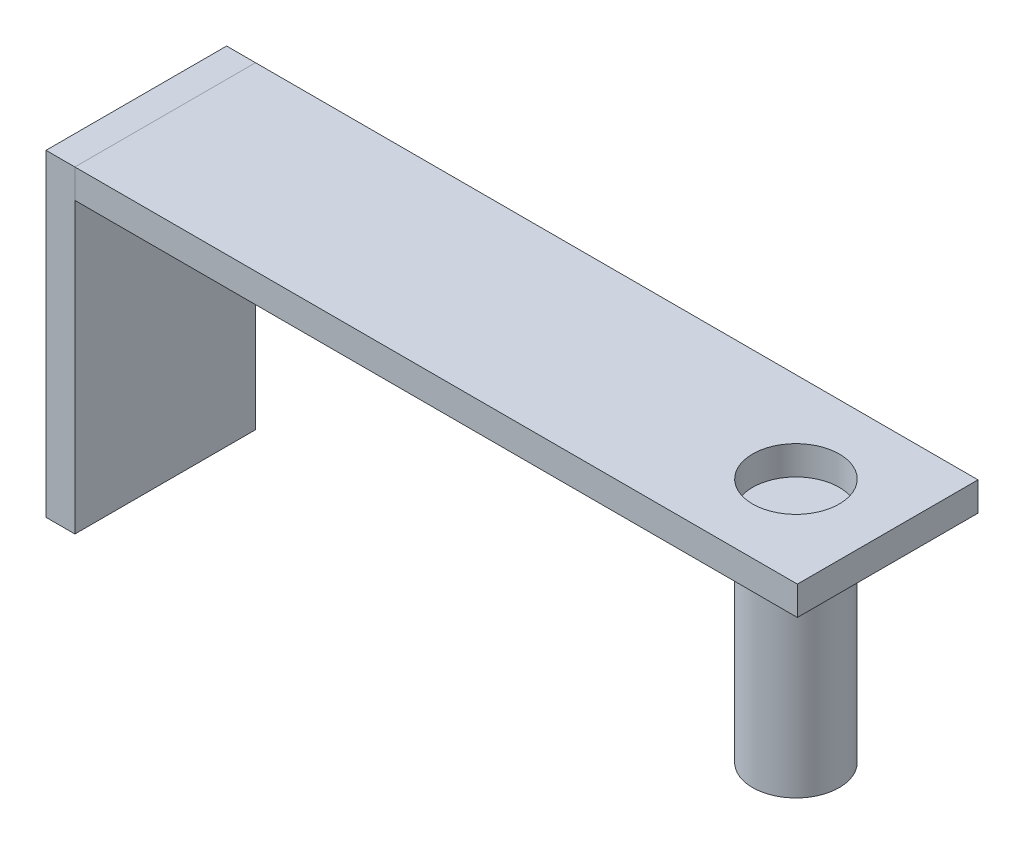
ISO-10303-21;
HEADER;
FILE_DESCRIPTION(('STEP AP214'),'2;1');
FILE_NAME('part.step','',(''),(''),'','','');
FILE_SCHEMA(('AUTOMOTIVE_DESIGN { 1 0 10303 214 1 1 1 1 }'));
ENDSEC;
DATA;
#1=APPLICATION_CONTEXT('core data for automotive mechanical design processes');
#2=APPLICATION_PROTOCOL_DEFINITION('international standard','automotive_design',2000,#1);
#3=PRODUCT_CONTEXT('',#1,'mechanical');
#4=PRODUCT('Part','Part','',(#3));
#5=PRODUCT_RELATED_PRODUCT_CATEGORY('part','',(#4));
#6=PRODUCT_DEFINITION_FORMATION('','',#4);
#7=PRODUCT_DEFINITION_CONTEXT('part definition',#1,'design');
#8=PRODUCT_DEFINITION('design','',#6,#7);
#9=PRODUCT_DEFINITION_SHAPE('','',#8);
#10=(LENGTH_UNIT() NAMED_UNIT(*) SI_UNIT(.MILLI.,.METRE.));
#11=(NAMED_UNIT(*) PLANE_ANGLE_UNIT() SI_UNIT($,.RADIAN.));
#12=(NAMED_UNIT(*) SI_UNIT($,.STERADIAN.) SOLID_ANGLE_UNIT());
#13=UNCERTAINTY_MEASURE_WITH_UNIT(LENGTH_MEASURE(1.E-05),#10,'distance_accuracy_value','');
#14=(GEOMETRIC_REPRESENTATION_CONTEXT(3) GLOBAL_UNCERTAINTY_ASSIGNED_CONTEXT((#13)) GLOBAL_UNIT_ASSIGNED_CONTEXT((#10,
#11,#12)) REPRESENTATION_CONTEXT('',''));
#15=CARTESIAN_POINT('',(0.,0.,0.));
#16=DIRECTION('',(0.,0.,1.));
#17=DIRECTION('',(1.,0.,0.));
#18=AXIS2_PLACEMENT_3D('',#15,#16,#17);
#19=CARTESIAN_POINT('',(18.65,-15.,0.));
#20=DIRECTION('',(0.,1.,0.));
#21=DIRECTION('',(0.,0.,1.));
#22=AXIS2_PLACEMENT_3D('',#19,#20,#21);
#23=CYLINDRICAL_SURFACE('',#22,2.99999999999999);
#24=CARTESIAN_POINT('',(18.65,-15.,0.));
#25=DIRECTION('',(0.,1.,0.));
#26=DIRECTION('',(0.,0.,1.));
#27=AXIS2_PLACEMENT_3D('',#24,#25,#26);
#28=CIRCLE('',#27,2.99999999999999);
#29=CARTESIAN_POINT('',(18.65,-15.,2.99999999999999));
#30=VERTEX_POINT('',#29);
#31=EDGE_CURVE('E11',#30,#30,#28,.T.);
#32=ORIENTED_EDGE('',*,*,#31,.T.);
#33=EDGE_LOOP('',(#32));
#34=FACE_BOUND('',#33,.T.);
#35=CARTESIAN_POINT('',(18.65,0.,0.));
#36=DIRECTION('',(0.,1.,0.));
#37=DIRECTION('',(0.,0.,1.));
#38=AXIS2_PLACEMENT_3D('',#35,#36,#37);
#39=CIRCLE('',#38,2.99999999999999);
#40=CARTESIAN_POINT('',(18.65,0.,2.99999999999999));
#41=VERTEX_POINT('',#40);
#42=EDGE_CURVE('E59',#41,#41,#39,.T.);
#43=ORIENTED_EDGE('',*,*,#42,.F.);
#44=EDGE_LOOP('',(#43));
#45=FACE_BOUND('',#44,.T.);
#46=ADVANCED_FACE('F56',(#34,#45),#23,.T.);
#47=CARTESIAN_POINT('',(0.,-15.,0.));
#48=DIRECTION('',(0.,1.,0.));
#49=DIRECTION('',(0.,0.,1.));
#50=AXIS2_PLACEMENT_3D('',#47,#48,#49);
#51=PLANE('',#50);
#52=ORIENTED_EDGE('',*,*,#31,.F.);
#53=EDGE_LOOP('',(#52));
#54=FACE_BOUND('',#53,.T.);
#55=ADVANCED_FACE('F71',(#54),#51,.F.);
#56=CARTESIAN_POINT('',(0.,0.,0.));
#57=DIRECTION('',(0.,1.,0.));
#58=DIRECTION('',(0.,0.,1.));
#59=AXIS2_PLACEMENT_3D('',#56,#57,#58);
#60=PLANE('',#59);
#61=ORIENTED_EDGE('',*,*,#42,.T.);
#62=EDGE_LOOP('',(#61));
#63=FACE_BOUND('',#62,.T.);
#64=ADVANCED_FACE('F68',(#63),#60,.T.);
#65=CLOSED_SHELL('',(#46,#55,#64));
#66=MANIFOLD_SOLID_BREP('B2',#65);
#67=CARTESIAN_POINT('',(25.,1.99999999999999,0.));
#68=DIRECTION('',(1.,0.,0.));
#69=DIRECTION('',(0.,0.,-1.));
#70=AXIS2_PLACEMENT_3D('',#67,#68,#69);
#71=PLANE('',#70);
#72=DIRECTION('',(0.,0.,1.));
#73=VECTOR('',#72,1.);
#74=CARTESIAN_POINT('',(25.,0.,0.));
#75=LINE('',#74,#73);
#76=CARTESIAN_POINT('',(25.,0.,-6.25));
#77=VERTEX_POINT('',#76);
#78=CARTESIAN_POINT('',(25.,0.,6.25));
#79=VERTEX_POINT('',#78);
#80=EDGE_CURVE('E184',#77,#79,#75,.T.);
#81=ORIENTED_EDGE('',*,*,#80,.F.);
#82=DIRECTION('',(0.,-1.,0.));
#83=VECTOR('',#82,1.);
#84=CARTESIAN_POINT('',(25.,1.99999999999999,-6.25));
#85=LINE('',#84,#83);
#86=CARTESIAN_POINT('',(25.,1.99999999999999,-6.25));
#87=VERTEX_POINT('',#86);
#88=EDGE_CURVE('E54',#87,#77,#85,.T.);
#89=ORIENTED_EDGE('',*,*,#88,.F.);
#90=DIRECTION('',(0.,0.,1.));
#91=VECTOR('',#90,1.);
#92=CARTESIAN_POINT('',(25.,1.99999999999999,0.));
#93=LINE('',#92,#91);
#94=CARTESIAN_POINT('',(25.,1.99999999999999,6.25));
#95=VERTEX_POINT('',#94);
#96=EDGE_CURVE('E170',#87,#95,#93,.T.);
#97=ORIENTED_EDGE('',*,*,#96,.T.);
#98=DIRECTION('',(0.,-1.,0.));
#99=VECTOR('',#98,1.);
#100=CARTESIAN_POINT('',(25.,1.99999999999999,6.25));
#101=LINE('',#100,#99);
#102=EDGE_CURVE('E147',#95,#79,#101,.T.);
#103=ORIENTED_EDGE('',*,*,#102,.T.);
#104=EDGE_LOOP('',(#81,#89,#97,#103));
#105=FACE_BOUND('',#104,.T.);
#106=ADVANCED_FACE('F106',(#105),#71,.T.);
#107=CARTESIAN_POINT('',(0.,1.99999999999999,-6.25));
#108=DIRECTION('',(0.,0.,-1.));
#109=DIRECTION('',(-1.,0.,0.));
#110=AXIS2_PLACEMENT_3D('',#107,#108,#109);
#111=PLANE('',#110);
#112=DIRECTION('',(1.,0.,0.));
#113=VECTOR('',#112,1.);
#114=CARTESIAN_POINT('',(0.,0.,-6.25));
#115=LINE('',#114,#113);
#116=CARTESIAN_POINT('',(-25.,0.,-6.25));
#117=VERTEX_POINT('',#116);
#118=EDGE_CURVE('E159',#117,#77,#115,.T.);
#119=ORIENTED_EDGE('',*,*,#118,.F.);
#120=DIRECTION('',(0.,-1.,0.));
#121=VECTOR('',#120,1.);
#122=CARTESIAN_POINT('',(-25.,1.99999999999999,-6.25));
#123=LINE('',#122,#121);
#124=CARTESIAN_POINT('',(-25.,1.99999999999999,-6.25));
#125=VERTEX_POINT('',#124);
#126=EDGE_CURVE('E116',#125,#117,#123,.T.);
#127=ORIENTED_EDGE('',*,*,#126,.F.);
#128=DIRECTION('',(1.,0.,0.));
#129=VECTOR('',#128,1.);
#130=CARTESIAN_POINT('',(0.,1.99999999999999,-6.25));
#131=LINE('',#130,#129);
#132=EDGE_CURVE('E157',#125,#87,#131,.T.);
#133=ORIENTED_EDGE('',*,*,#132,.T.);
#134=ORIENTED_EDGE('',*,*,#88,.T.);
#135=EDGE_LOOP('',(#119,#127,#133,#134));
#136=FACE_BOUND('',#135,.T.);
#137=ADVANCED_FACE('F155',(#136),#111,.T.);
#138=CARTESIAN_POINT('',(-25.,1.99999999999999,0.));
#139=DIRECTION('',(1.,0.,0.));
#140=DIRECTION('',(0.,0.,-1.));
#141=AXIS2_PLACEMENT_3D('',#138,#139,#140);
#142=PLANE('',#141);
#143=DIRECTION('',(0.,0.,1.));
#144=VECTOR('',#143,1.);
#145=CARTESIAN_POINT('',(-25.,0.,0.));
#146=LINE('',#145,#144);
#147=CARTESIAN_POINT('',(-25.,0.,6.25));
#148=VERTEX_POINT('',#147);
#149=EDGE_CURVE('E189',#117,#148,#146,.T.);
#150=ORIENTED_EDGE('',*,*,#149,.T.);
#151=DIRECTION('',(0.,-1.,0.));
#152=VECTOR('',#151,1.);
#153=CARTESIAN_POINT('',(-25.,1.99999999999999,6.25));
#154=LINE('',#153,#152);
#155=CARTESIAN_POINT('',(-25.,1.99999999999999,6.25));
#156=VERTEX_POINT('',#155);
#157=EDGE_CURVE('E163',#156,#148,#154,.T.);
#158=ORIENTED_EDGE('',*,*,#157,.F.);
#159=DIRECTION('',(0.,0.,1.));
#160=VECTOR('',#159,1.);
#161=CARTESIAN_POINT('',(-25.,1.99999999999999,0.));
#162=LINE('',#161,#160);
#163=EDGE_CURVE('E165',#125,#156,#162,.T.);
#164=ORIENTED_EDGE('',*,*,#163,.F.);
#165=ORIENTED_EDGE('',*,*,#126,.T.);
#166=EDGE_LOOP('',(#150,#158,#164,#165));
#167=FACE_BOUND('',#166,.T.);
#168=ADVANCED_FACE('F166',(#167),#142,.F.);
#169=CARTESIAN_POINT('',(18.65,1.99999999999999,0.));
#170=DIRECTION('',(0.,-1.,0.));
#171=DIRECTION('',(0.,0.,-1.));
#172=AXIS2_PLACEMENT_3D('',#169,#170,#171);
#173=CYLINDRICAL_SURFACE('',#172,2.99999999999999);
#174=CARTESIAN_POINT('',(18.65,1.99999999999999,0.));
#175=DIRECTION('',(0.,1.,0.));
#176=DIRECTION('',(0.,0.,1.));
#177=AXIS2_PLACEMENT_3D('',#174,#175,#176);
#178=CIRCLE('',#177,2.99999999999999);
#179=CARTESIAN_POINT('',(18.65,1.99999999999999,2.99999999999999));
#180=VERTEX_POINT('',#179);
#181=EDGE_CURVE('E174',#180,#180,#178,.T.);
#182=ORIENTED_EDGE('',*,*,#181,.T.);
#183=EDGE_LOOP('',(#182));
#184=FACE_BOUND('',#183,.T.);
#185=CARTESIAN_POINT('',(18.65,0.,0.));
#186=DIRECTION('',(0.,1.,0.));
#187=DIRECTION('',(0.,0.,1.));
#188=AXIS2_PLACEMENT_3D('',#185,#186,#187);
#189=CIRCLE('',#188,2.99999999999999);
#190=CARTESIAN_POINT('',(18.65,0.,2.99999999999999));
#191=VERTEX_POINT('',#190);
#192=EDGE_CURVE('E180',#191,#191,#189,.T.);
#193=ORIENTED_EDGE('',*,*,#192,.F.);
#194=EDGE_LOOP('',(#193));
#195=FACE_BOUND('',#194,.T.);
#196=ADVANCED_FACE('F108',(#184,#195),#173,.F.);
#197=CARTESIAN_POINT('',(0.,1.99999999999999,6.25));
#198=DIRECTION('',(0.,0.,-1.));
#199=DIRECTION('',(-1.,0.,0.));
#200=AXIS2_PLACEMENT_3D('',#197,#198,#199);
#201=PLANE('',#200);
#202=DIRECTION('',(1.,0.,0.));
#203=VECTOR('',#202,1.);
#204=CARTESIAN_POINT('',(0.,0.,6.25));
#205=LINE('',#204,#203);
#206=EDGE_CURVE('E140',#148,#79,#205,.T.);
#207=ORIENTED_EDGE('',*,*,#206,.T.);
#208=ORIENTED_EDGE('',*,*,#102,.F.);
#209=DIRECTION('',(1.,0.,0.));
#210=VECTOR('',#209,1.);
#211=CARTESIAN_POINT('',(0.,1.99999999999999,6.25));
#212=LINE('',#211,#210);
#213=EDGE_CURVE('E124',#156,#95,#212,.T.);
#214=ORIENTED_EDGE('',*,*,#213,.F.);
#215=ORIENTED_EDGE('',*,*,#157,.T.);
#216=EDGE_LOOP('',(#207,#208,#214,#215));
#217=FACE_BOUND('',#216,.T.);
#218=ADVANCED_FACE('F198',(#217),#201,.F.);
#219=CARTESIAN_POINT('',(0.,1.99999999999999,0.));
#220=DIRECTION('',(0.,1.,0.));
#221=DIRECTION('',(0.,0.,1.));
#222=AXIS2_PLACEMENT_3D('',#219,#220,#221);
#223=PLANE('',#222);
#224=ORIENTED_EDGE('',*,*,#181,.F.);
#225=EDGE_LOOP('',(#224));
#226=FACE_BOUND('',#225,.T.);
#227=ORIENTED_EDGE('',*,*,#96,.F.);
#228=ORIENTED_EDGE('',*,*,#132,.F.);
#229=ORIENTED_EDGE('',*,*,#163,.T.);
#230=ORIENTED_EDGE('',*,*,#213,.T.);
#231=EDGE_LOOP('',(#227,#228,#229,#230));
#232=FACE_BOUND('',#231,.T.);
#233=ADVANCED_FACE('F169',(#226,#232),#223,.T.);
#234=CARTESIAN_POINT('',(0.,0.,0.));
#235=DIRECTION('',(0.,1.,0.));
#236=DIRECTION('',(0.,0.,1.));
#237=AXIS2_PLACEMENT_3D('',#234,#235,#236);
#238=PLANE('',#237);
#239=ORIENTED_EDGE('',*,*,#192,.T.);
#240=EDGE_LOOP('',(#239));
#241=FACE_BOUND('',#240,.T.);
#242=ORIENTED_EDGE('',*,*,#80,.T.);
#243=ORIENTED_EDGE('',*,*,#206,.F.);
#244=ORIENTED_EDGE('',*,*,#149,.F.);
#245=ORIENTED_EDGE('',*,*,#118,.T.);
#246=EDGE_LOOP('',(#242,#243,#244,#245));
#247=FACE_BOUND('',#246,.T.);
#248=ADVANCED_FACE('F199',(#241,#247),#238,.F.);
#249=CLOSED_SHELL('',(#106,#137,#168,#196,#218,#233,#248));
#250=MANIFOLD_SOLID_BREP('B6',#249);
#251=CARTESIAN_POINT('',(-27.,1.99999999999999,0.));
#252=DIRECTION('',(-1.,0.,0.));
#253=DIRECTION('',(0.,0.,1.));
#254=AXIS2_PLACEMENT_3D('',#251,#252,#253);
#255=PLANE('',#254);
#256=DIRECTION('',(0.,-1.,0.));
#257=VECTOR('',#256,1.);
#258=CARTESIAN_POINT('',(-27.,1.99999999999999,-6.25));
#259=LINE('',#258,#257);
#260=CARTESIAN_POINT('',(-27.,1.99999999999999,-6.25));
#261=VERTEX_POINT('',#260);
#262=CARTESIAN_POINT('',(-27.,-20.,-6.25));
#263=VERTEX_POINT('',#262);
#264=EDGE_CURVE('E326',#261,#263,#259,.T.);
#265=ORIENTED_EDGE('',*,*,#264,.T.);
#266=DIRECTION('',(0.,0.,-1.));
#267=VECTOR('',#266,1.);
#268=CARTESIAN_POINT('',(-27.,-20.,0.));
#269=LINE('',#268,#267);
#270=CARTESIAN_POINT('',(-27.,-20.,6.25));
#271=VERTEX_POINT('',#270);
#272=EDGE_CURVE('E322',#271,#263,#269,.T.);
#273=ORIENTED_EDGE('',*,*,#272,.F.);
#274=DIRECTION('',(0.,-1.,0.));
#275=VECTOR('',#274,1.);
#276=CARTESIAN_POINT('',(-27.,1.99999999999999,6.25));
#277=LINE('',#276,#275);
#278=CARTESIAN_POINT('',(-27.,1.99999999999999,6.25));
#279=VERTEX_POINT('',#278);
#280=EDGE_CURVE('E104',#279,#271,#277,.T.);
#281=ORIENTED_EDGE('',*,*,#280,.F.);
#282=DIRECTION('',(0.,0.,-1.));
#283=VECTOR('',#282,1.);
#284=CARTESIAN_POINT('',(-27.,1.99999999999999,0.));
#285=LINE('',#284,#283);
#286=EDGE_CURVE('E332',#279,#261,#285,.T.);
#287=ORIENTED_EDGE('',*,*,#286,.T.);
#288=EDGE_LOOP('',(#265,#273,#281,#287));
#289=FACE_BOUND('',#288,.T.);
#290=ADVANCED_FACE('F268',(#289),#255,.T.);
#291=CARTESIAN_POINT('',(0.,1.99999999999999,6.25000000000001));
#292=DIRECTION('',(0.,0.,1.));
#293=DIRECTION('',(1.,0.,0.));
#294=AXIS2_PLACEMENT_3D('',#291,#292,#293);
#295=PLANE('',#294);
#296=ORIENTED_EDGE('',*,*,#280,.T.);
#297=DIRECTION('',(-1.,0.,0.));
#298=VECTOR('',#297,1.);
#299=CARTESIAN_POINT('',(0.,-20.,6.25000000000001));
#300=LINE('',#299,#298);
#301=CARTESIAN_POINT('',(-25.,-20.,6.25));
#302=VERTEX_POINT('',#301);
#303=EDGE_CURVE('E311',#302,#271,#300,.T.);
#304=ORIENTED_EDGE('',*,*,#303,.F.);
#305=DIRECTION('',(0.,-1.,0.));
#306=VECTOR('',#305,1.);
#307=CARTESIAN_POINT('',(-25.,1.99999999999999,6.25));
#308=LINE('',#307,#306);
#309=CARTESIAN_POINT('',(-25.,1.99999999999999,6.25));
#310=VERTEX_POINT('',#309);
#311=EDGE_CURVE('E275',#310,#302,#308,.T.);
#312=ORIENTED_EDGE('',*,*,#311,.F.);
#313=DIRECTION('',(-1.,0.,0.));
#314=VECTOR('',#313,1.);
#315=CARTESIAN_POINT('',(0.,1.99999999999999,6.25000000000001));
#316=LINE('',#315,#314);
#317=EDGE_CURVE('E313',#310,#279,#316,.T.);
#318=ORIENTED_EDGE('',*,*,#317,.T.);
#319=EDGE_LOOP('',(#296,#304,#312,#318));
#320=FACE_BOUND('',#319,.T.);
#321=ADVANCED_FACE('F310',(#320),#295,.T.);
#322=CARTESIAN_POINT('',(-25.,1.99999999999999,0.));
#323=DIRECTION('',(1.,0.,0.));
#324=DIRECTION('',(0.,0.,-1.));
#325=AXIS2_PLACEMENT_3D('',#322,#323,#324);
#326=PLANE('',#325);
#327=ORIENTED_EDGE('',*,*,#311,.T.);
#328=DIRECTION('',(0.,0.,1.));
#329=VECTOR('',#328,1.);
#330=CARTESIAN_POINT('',(-25.,-20.,0.));
#331=LINE('',#330,#329);
#332=CARTESIAN_POINT('',(-25.,-20.,-6.25));
#333=VERTEX_POINT('',#332);
#334=EDGE_CURVE('E324',#333,#302,#331,.T.);
#335=ORIENTED_EDGE('',*,*,#334,.F.);
#336=DIRECTION('',(0.,-1.,0.));
#337=VECTOR('',#336,1.);
#338=CARTESIAN_POINT('',(-25.,1.99999999999999,-6.25));
#339=LINE('',#338,#337);
#340=CARTESIAN_POINT('',(-25.,1.99999999999999,-6.25));
#341=VERTEX_POINT('',#340);
#342=EDGE_CURVE('E290',#341,#333,#339,.T.);
#343=ORIENTED_EDGE('',*,*,#342,.F.);
#344=DIRECTION('',(0.,0.,1.));
#345=VECTOR('',#344,1.);
#346=CARTESIAN_POINT('',(-25.,1.99999999999999,0.));
#347=LINE('',#346,#345);
#348=EDGE_CURVE('E335',#341,#310,#347,.T.);
#349=ORIENTED_EDGE('',*,*,#348,.T.);
#350=EDGE_LOOP('',(#327,#335,#343,#349));
#351=FACE_BOUND('',#350,.T.);
#352=ADVANCED_FACE('F339',(#351),#326,.T.);
#353=CARTESIAN_POINT('',(0.,1.99999999999999,-6.25000000000001));
#354=DIRECTION('',(0.,0.,1.));
#355=DIRECTION('',(1.,0.,0.));
#356=AXIS2_PLACEMENT_3D('',#353,#354,#355);
#357=PLANE('',#356);
#358=ORIENTED_EDGE('',*,*,#342,.T.);
#359=DIRECTION('',(-1.,0.,0.));
#360=VECTOR('',#359,1.);
#361=CARTESIAN_POINT('',(0.,-20.,-6.25000000000001));
#362=LINE('',#361,#360);
#363=EDGE_CURVE('E330',#333,#263,#362,.T.);
#364=ORIENTED_EDGE('',*,*,#363,.T.);
#365=ORIENTED_EDGE('',*,*,#264,.F.);
#366=DIRECTION('',(-1.,0.,0.));
#367=VECTOR('',#366,1.);
#368=CARTESIAN_POINT('',(0.,1.99999999999999,-6.25000000000001));
#369=LINE('',#368,#367);
#370=EDGE_CURVE('E282',#341,#261,#369,.T.);
#371=ORIENTED_EDGE('',*,*,#370,.F.);
#372=EDGE_LOOP('',(#358,#364,#365,#371));
#373=FACE_BOUND('',#372,.T.);
#374=ADVANCED_FACE('F342',(#373),#357,.F.);
#375=CARTESIAN_POINT('',(0.,1.99999999999999,0.));
#376=DIRECTION('',(0.,1.,0.));
#377=DIRECTION('',(0.,0.,1.));
#378=AXIS2_PLACEMENT_3D('',#375,#376,#377);
#379=PLANE('',#378);
#380=ORIENTED_EDGE('',*,*,#286,.F.);
#381=ORIENTED_EDGE('',*,*,#317,.F.);
#382=ORIENTED_EDGE('',*,*,#348,.F.);
#383=ORIENTED_EDGE('',*,*,#370,.T.);
#384=EDGE_LOOP('',(#380,#381,#382,#383));
#385=FACE_BOUND('',#384,.T.);
#386=ADVANCED_FACE('F340',(#385),#379,.T.);
#387=CARTESIAN_POINT('',(0.,-20.,0.));
#388=DIRECTION('',(0.,1.,0.));
#389=DIRECTION('',(0.,0.,1.));
#390=AXIS2_PLACEMENT_3D('',#387,#388,#389);
#391=PLANE('',#390);
#392=ORIENTED_EDGE('',*,*,#272,.T.);
#393=ORIENTED_EDGE('',*,*,#363,.F.);
#394=ORIENTED_EDGE('',*,*,#334,.T.);
#395=ORIENTED_EDGE('',*,*,#303,.T.);
#396=EDGE_LOOP('',(#392,#393,#394,#395));
#397=FACE_BOUND('',#396,.T.);
#398=ADVANCED_FACE('F320',(#397),#391,.F.);
#399=CLOSED_SHELL('',(#290,#321,#352,#374,#386,#398));
#400=MANIFOLD_SOLID_BREP('B48',#399);
#401=ADVANCED_BREP_SHAPE_REPRESENTATION('',(#18,#66,#250,#400),#14);
#402=SHAPE_DEFINITION_REPRESENTATION(#9,#401);
ENDSEC;
END-ISO-10303-21;
